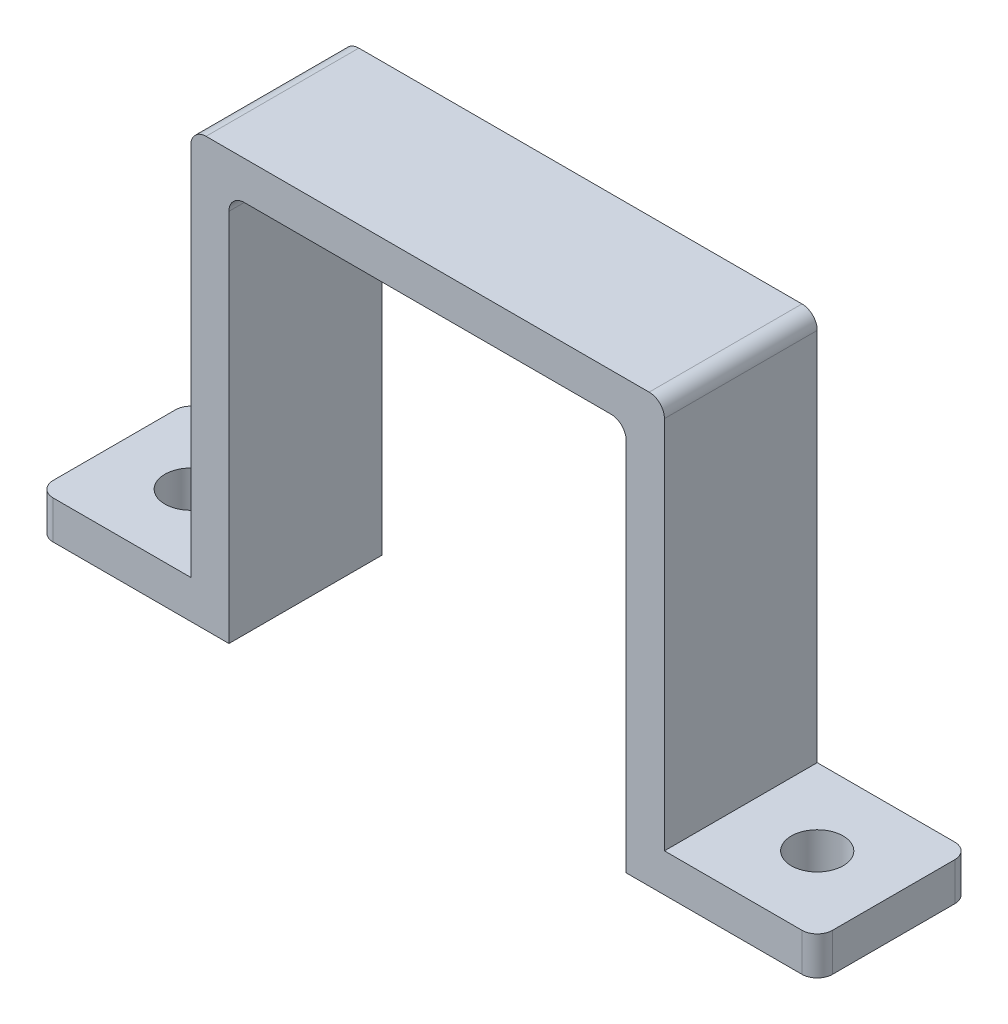
ISO-10303-21;
HEADER;
FILE_DESCRIPTION(('STEP AP214'),'2;1');
FILE_NAME('part.step','',(''),(''),'','','');
FILE_SCHEMA(('AUTOMOTIVE_DESIGN { 1 0 10303 214 1 1 1 1 }'));
ENDSEC;
DATA;
#1=APPLICATION_CONTEXT('core data for automotive mechanical design processes');
#2=APPLICATION_PROTOCOL_DEFINITION('international standard','automotive_design',2000,#1);
#3=PRODUCT_CONTEXT('',#1,'mechanical');
#4=PRODUCT('Part','Part','',(#3));
#5=PRODUCT_RELATED_PRODUCT_CATEGORY('part','',(#4));
#6=PRODUCT_DEFINITION_FORMATION('','',#4);
#7=PRODUCT_DEFINITION_CONTEXT('part definition',#1,'design');
#8=PRODUCT_DEFINITION('design','',#6,#7);
#9=PRODUCT_DEFINITION_SHAPE('','',#8);
#10=(LENGTH_UNIT() NAMED_UNIT(*) SI_UNIT(.MILLI.,.METRE.));
#11=(NAMED_UNIT(*) PLANE_ANGLE_UNIT() SI_UNIT($,.RADIAN.));
#12=(NAMED_UNIT(*) SI_UNIT($,.STERADIAN.) SOLID_ANGLE_UNIT());
#13=UNCERTAINTY_MEASURE_WITH_UNIT(LENGTH_MEASURE(1.E-05),#10,'distance_accuracy_value','');
#14=(GEOMETRIC_REPRESENTATION_CONTEXT(3) GLOBAL_UNCERTAINTY_ASSIGNED_CONTEXT((#13)) GLOBAL_UNIT_ASSIGNED_CONTEXT((#10,
#11,#12)) REPRESENTATION_CONTEXT('',''));
#15=CARTESIAN_POINT('',(0.,0.,0.));
#16=DIRECTION('',(0.,0.,1.));
#17=DIRECTION('',(1.,0.,0.));
#18=AXIS2_PLACEMENT_3D('',#15,#16,#17);
#19=CARTESIAN_POINT('',(-15.875,3.175,12.7));
#20=DIRECTION('',(1.,0.,0.));
#21=DIRECTION('',(0.,0.,-1.));
#22=AXIS2_PLACEMENT_3D('',#19,#20,#21);
#23=PLANE('',#22);
#24=DIRECTION('',(0.,0.,-1.));
#25=VECTOR('',#24,1.);
#26=CARTESIAN_POINT('',(-15.875,3.175,12.7));
#27=LINE('',#26,#25);
#28=CARTESIAN_POINT('',(-15.875,3.175,11.43));
#29=VERTEX_POINT('',#28);
#30=CARTESIAN_POINT('',(-15.875,3.175,1.27));
#31=VERTEX_POINT('',#30);
#32=EDGE_CURVE('E244',#29,#31,#27,.T.);
#33=ORIENTED_EDGE('',*,*,#32,.T.);
#34=DIRECTION('',(0.,-1.,0.));
#35=VECTOR('',#34,1.);
#36=CARTESIAN_POINT('',(-15.875,3.175,1.27));
#37=LINE('',#36,#35);
#38=CARTESIAN_POINT('',(-15.875,0.,1.27));
#39=VERTEX_POINT('',#38);
#40=EDGE_CURVE('E304',#31,#39,#37,.T.);
#41=ORIENTED_EDGE('',*,*,#40,.T.);
#42=DIRECTION('',(0.,0.,-1.));
#43=VECTOR('',#42,1.);
#44=CARTESIAN_POINT('',(-15.875,0.,12.7));
#45=LINE('',#44,#43);
#46=CARTESIAN_POINT('',(-15.875,0.,11.43));
#47=VERTEX_POINT('',#46);
#48=EDGE_CURVE('E206',#47,#39,#45,.T.);
#49=ORIENTED_EDGE('',*,*,#48,.F.);
#50=DIRECTION('',(0.,-1.,0.));
#51=VECTOR('',#50,1.);
#52=CARTESIAN_POINT('',(-15.875,3.175,11.43));
#53=LINE('',#52,#51);
#54=EDGE_CURVE('E301',#47,#29,#53,.F.);
#55=ORIENTED_EDGE('',*,*,#54,.T.);
#56=EDGE_LOOP('',(#33,#41,#49,#55));
#57=FACE_BOUND('',#56,.T.);
#58=ADVANCED_FACE('F43',(#57),#23,.F.);
#59=CARTESIAN_POINT('',(-15.875,0.,12.7));
#60=DIRECTION('',(0.,1.,0.));
#61=DIRECTION('',(0.,0.,1.));
#62=AXIS2_PLACEMENT_3D('',#59,#60,#61);
#63=PLANE('',#62);
#64=CARTESIAN_POINT('',(-9.525,0.,6.35));
#65=DIRECTION('',(0.,1.,0.));
#66=DIRECTION('',(0.,0.,1.));
#67=AXIS2_PLACEMENT_3D('',#64,#65,#66);
#68=CIRCLE('',#67,2.15265);
#69=CARTESIAN_POINT('',(-9.525,0.,8.50265));
#70=VERTEX_POINT('',#69);
#71=EDGE_CURVE('E525',#70,#70,#68,.T.);
#72=ORIENTED_EDGE('',*,*,#71,.T.);
#73=EDGE_LOOP('',(#72));
#74=FACE_BOUND('',#73,.T.);
#75=ORIENTED_EDGE('',*,*,#48,.T.);
#76=CARTESIAN_POINT('',(-14.605,0.,1.27));
#77=DIRECTION('',(0.,1.,0.));
#78=DIRECTION('',(0.,0.,1.));
#79=AXIS2_PLACEMENT_3D('',#76,#77,#78);
#80=CIRCLE('',#79,1.27);
#81=CARTESIAN_POINT('',(-14.605,0.,0.));
#82=VERTEX_POINT('',#81);
#83=EDGE_CURVE('E311',#39,#82,#80,.F.);
#84=ORIENTED_EDGE('',*,*,#83,.T.);
#85=DIRECTION('',(1.,0.,0.));
#86=VECTOR('',#85,1.);
#87=CARTESIAN_POINT('',(-15.875,0.,0.));
#88=LINE('',#87,#86);
#89=CARTESIAN_POINT('',(0.,0.,0.));
#90=VERTEX_POINT('',#89);
#91=EDGE_CURVE('E201',#82,#90,#88,.T.);
#92=ORIENTED_EDGE('',*,*,#91,.T.);
#93=DIRECTION('',(0.,0.,-1.));
#94=VECTOR('',#93,1.);
#95=CARTESIAN_POINT('',(0.,0.,12.7));
#96=LINE('',#95,#94);
#97=CARTESIAN_POINT('',(0.,0.,12.7));
#98=VERTEX_POINT('',#97);
#99=EDGE_CURVE('E197',#98,#90,#96,.T.);
#100=ORIENTED_EDGE('',*,*,#99,.F.);
#101=DIRECTION('',(1.,0.,0.));
#102=VECTOR('',#101,1.);
#103=CARTESIAN_POINT('',(-15.875,0.,12.7));
#104=LINE('',#103,#102);
#105=CARTESIAN_POINT('',(-14.605,0.,12.7));
#106=VERTEX_POINT('',#105);
#107=EDGE_CURVE('E183',#106,#98,#104,.T.);
#108=ORIENTED_EDGE('',*,*,#107,.F.);
#109=CARTESIAN_POINT('',(-14.605,0.,11.43));
#110=DIRECTION('',(0.,1.,0.));
#111=DIRECTION('',(0.,0.,1.));
#112=AXIS2_PLACEMENT_3D('',#109,#110,#111);
#113=CIRCLE('',#112,1.27);
#114=EDGE_CURVE('E308',#106,#47,#113,.F.);
#115=ORIENTED_EDGE('',*,*,#114,.T.);
#116=EDGE_LOOP('',(#75,#84,#92,#100,#108,#115));
#117=FACE_BOUND('',#116,.T.);
#118=ADVANCED_FACE('F199',(#74,#117),#63,.F.);
#119=CARTESIAN_POINT('',(0.,0.,12.7));
#120=DIRECTION('',(-1.,0.,0.));
#121=DIRECTION('',(0.,0.,1.));
#122=AXIS2_PLACEMENT_3D('',#119,#120,#121);
#123=PLANE('',#122);
#124=DIRECTION('',(0.,1.,0.));
#125=VECTOR('',#124,1.);
#126=CARTESIAN_POINT('',(0.,0.,0.));
#127=LINE('',#126,#125);
#128=CARTESIAN_POINT('',(0.,31.115,0.));
#129=VERTEX_POINT('',#128);
#130=EDGE_CURVE('E247',#90,#129,#127,.T.);
#131=ORIENTED_EDGE('',*,*,#130,.T.);
#132=DIRECTION('',(0.,0.,-1.));
#133=VECTOR('',#132,1.);
#134=CARTESIAN_POINT('',(0.,31.115,12.7));
#135=LINE('',#134,#133);
#136=CARTESIAN_POINT('',(0.,31.115,12.7));
#137=VERTEX_POINT('',#136);
#138=EDGE_CURVE('E211',#129,#137,#135,.F.);
#139=ORIENTED_EDGE('',*,*,#138,.T.);
#140=DIRECTION('',(0.,1.,0.));
#141=VECTOR('',#140,1.);
#142=CARTESIAN_POINT('',(0.,0.,12.7));
#143=LINE('',#142,#141);
#144=EDGE_CURVE('E188',#98,#137,#143,.T.);
#145=ORIENTED_EDGE('',*,*,#144,.F.);
#146=ORIENTED_EDGE('',*,*,#99,.T.);
#147=EDGE_LOOP('',(#131,#139,#145,#146));
#148=FACE_BOUND('',#147,.T.);
#149=ADVANCED_FACE('F209',(#148),#123,.F.);
#150=CARTESIAN_POINT('',(0.,32.385,12.7));
#151=DIRECTION('',(0.,1.,0.));
#152=DIRECTION('',(0.,0.,1.));
#153=AXIS2_PLACEMENT_3D('',#150,#151,#152);
#154=PLANE('',#153);
#155=DIRECTION('',(1.,0.,0.));
#156=VECTOR('',#155,1.);
#157=CARTESIAN_POINT('',(0.,32.385,0.));
#158=LINE('',#157,#156);
#159=CARTESIAN_POINT('',(1.27,32.385,0.));
#160=VERTEX_POINT('',#159);
#161=CARTESIAN_POINT('',(31.75,32.385,0.));
#162=VERTEX_POINT('',#161);
#163=EDGE_CURVE('E251',#160,#162,#158,.T.);
#164=ORIENTED_EDGE('',*,*,#163,.T.);
#165=DIRECTION('',(0.,0.,-1.));
#166=VECTOR('',#165,1.);
#167=CARTESIAN_POINT('',(31.75,32.385,12.7));
#168=LINE('',#167,#166);
#169=CARTESIAN_POINT('',(31.75,32.385,12.7));
#170=VERTEX_POINT('',#169);
#171=EDGE_CURVE('E379',#162,#170,#168,.F.);
#172=ORIENTED_EDGE('',*,*,#171,.T.);
#173=DIRECTION('',(1.,0.,0.));
#174=VECTOR('',#173,1.);
#175=CARTESIAN_POINT('',(0.,32.385,12.7));
#176=LINE('',#175,#174);
#177=CARTESIAN_POINT('',(1.27,32.385,12.7));
#178=VERTEX_POINT('',#177);
#179=EDGE_CURVE('E213',#178,#170,#176,.T.);
#180=ORIENTED_EDGE('',*,*,#179,.F.);
#181=DIRECTION('',(0.,0.,-1.));
#182=VECTOR('',#181,1.);
#183=CARTESIAN_POINT('',(1.27,32.385,0.));
#184=LINE('',#183,#182);
#185=EDGE_CURVE('E375',#178,#160,#184,.T.);
#186=ORIENTED_EDGE('',*,*,#185,.T.);
#187=EDGE_LOOP('',(#164,#172,#180,#186));
#188=FACE_BOUND('',#187,.T.);
#189=ADVANCED_FACE('F403',(#188),#154,.F.);
#190=CARTESIAN_POINT('',(33.02,32.385,12.7));
#191=DIRECTION('',(1.,0.,0.));
#192=DIRECTION('',(0.,0.,-1.));
#193=AXIS2_PLACEMENT_3D('',#190,#191,#192);
#194=PLANE('',#193);
#195=DIRECTION('',(0.,-1.,0.));
#196=VECTOR('',#195,1.);
#197=CARTESIAN_POINT('',(33.02,32.385,12.7));
#198=LINE('',#197,#196);
#199=CARTESIAN_POINT('',(33.02,31.115,12.7));
#200=VERTEX_POINT('',#199);
#201=CARTESIAN_POINT('',(33.02,0.,12.7));
#202=VERTEX_POINT('',#201);
#203=EDGE_CURVE('E217',#200,#202,#198,.T.);
#204=ORIENTED_EDGE('',*,*,#203,.F.);
#205=DIRECTION('',(0.,0.,-1.));
#206=VECTOR('',#205,1.);
#207=CARTESIAN_POINT('',(33.02,31.115,0.));
#208=LINE('',#207,#206);
#209=CARTESIAN_POINT('',(33.02,31.115,0.));
#210=VERTEX_POINT('',#209);
#211=EDGE_CURVE('E371',#200,#210,#208,.T.);
#212=ORIENTED_EDGE('',*,*,#211,.T.);
#213=DIRECTION('',(0.,-1.,0.));
#214=VECTOR('',#213,1.);
#215=CARTESIAN_POINT('',(33.02,32.385,0.));
#216=LINE('',#215,#214);
#217=CARTESIAN_POINT('',(33.02,0.,0.));
#218=VERTEX_POINT('',#217);
#219=EDGE_CURVE('E255',#210,#218,#216,.T.);
#220=ORIENTED_EDGE('',*,*,#219,.T.);
#221=DIRECTION('',(0.,0.,-1.));
#222=VECTOR('',#221,1.);
#223=CARTESIAN_POINT('',(33.02,0.,12.7));
#224=LINE('',#223,#222);
#225=EDGE_CURVE('E207',#202,#218,#224,.T.);
#226=ORIENTED_EDGE('',*,*,#225,.F.);
#227=EDGE_LOOP('',(#204,#212,#220,#226));
#228=FACE_BOUND('',#227,.T.);
#229=ADVANCED_FACE('F411',(#228),#194,.F.);
#230=CARTESIAN_POINT('',(33.02,0.,12.7));
#231=DIRECTION('',(0.,1.,0.));
#232=DIRECTION('',(0.,0.,1.));
#233=AXIS2_PLACEMENT_3D('',#230,#231,#232);
#234=PLANE('',#233);
#235=CARTESIAN_POINT('',(42.545,0.,6.35));
#236=DIRECTION('',(0.,1.,0.));
#237=DIRECTION('',(0.,0.,1.));
#238=AXIS2_PLACEMENT_3D('',#235,#236,#237);
#239=CIRCLE('',#238,2.15265);
#240=CARTESIAN_POINT('',(42.545,0.,8.50265));
#241=VERTEX_POINT('',#240);
#242=EDGE_CURVE('E248',#241,#241,#239,.T.);
#243=ORIENTED_EDGE('',*,*,#242,.T.);
#244=EDGE_LOOP('',(#243));
#245=FACE_BOUND('',#244,.T.);
#246=DIRECTION('',(1.,0.,0.));
#247=VECTOR('',#246,1.);
#248=CARTESIAN_POINT('',(33.02,0.,0.));
#249=LINE('',#248,#247);
#250=CARTESIAN_POINT('',(47.625,0.,0.));
#251=VERTEX_POINT('',#250);
#252=EDGE_CURVE('E258',#218,#251,#249,.T.);
#253=ORIENTED_EDGE('',*,*,#252,.T.);
#254=CARTESIAN_POINT('',(47.625,0.,1.27));
#255=DIRECTION('',(0.,1.,0.));
#256=DIRECTION('',(0.,0.,1.));
#257=AXIS2_PLACEMENT_3D('',#254,#255,#256);
#258=CIRCLE('',#257,1.27);
#259=CARTESIAN_POINT('',(48.895,0.,1.27));
#260=VERTEX_POINT('',#259);
#261=EDGE_CURVE('E59',#251,#260,#258,.F.);
#262=ORIENTED_EDGE('',*,*,#261,.T.);
#263=DIRECTION('',(0.,0.,-1.));
#264=VECTOR('',#263,1.);
#265=CARTESIAN_POINT('',(48.895,0.,12.7));
#266=LINE('',#265,#264);
#267=CARTESIAN_POINT('',(48.895,0.,11.43));
#268=VERTEX_POINT('',#267);
#269=EDGE_CURVE('E293',#268,#260,#266,.T.);
#270=ORIENTED_EDGE('',*,*,#269,.F.);
#271=CARTESIAN_POINT('',(47.625,0.,11.43));
#272=DIRECTION('',(0.,1.,0.));
#273=DIRECTION('',(0.,0.,1.));
#274=AXIS2_PLACEMENT_3D('',#271,#272,#273);
#275=CIRCLE('',#274,1.27);
#276=CARTESIAN_POINT('',(47.625,0.,12.7));
#277=VERTEX_POINT('',#276);
#278=EDGE_CURVE('E356',#268,#277,#275,.F.);
#279=ORIENTED_EDGE('',*,*,#278,.T.);
#280=DIRECTION('',(1.,0.,0.));
#281=VECTOR('',#280,1.);
#282=CARTESIAN_POINT('',(33.02,0.,12.7));
#283=LINE('',#282,#281);
#284=EDGE_CURVE('E223',#202,#277,#283,.T.);
#285=ORIENTED_EDGE('',*,*,#284,.F.);
#286=ORIENTED_EDGE('',*,*,#225,.T.);
#287=EDGE_LOOP('',(#253,#262,#270,#279,#285,#286));
#288=FACE_BOUND('',#287,.T.);
#289=ADVANCED_FACE('F415',(#245,#288),#234,.F.);
#290=CARTESIAN_POINT('',(48.895,0.,12.7));
#291=DIRECTION('',(-1.,0.,0.));
#292=DIRECTION('',(0.,0.,1.));
#293=AXIS2_PLACEMENT_3D('',#290,#291,#292);
#294=PLANE('',#293);
#295=ORIENTED_EDGE('',*,*,#269,.T.);
#296=DIRECTION('',(0.,1.,0.));
#297=VECTOR('',#296,1.);
#298=CARTESIAN_POINT('',(48.895,0.,1.27));
#299=LINE('',#298,#297);
#300=CARTESIAN_POINT('',(48.895,3.17500000000001,1.27));
#301=VERTEX_POINT('',#300);
#302=EDGE_CURVE('E346',#260,#301,#299,.T.);
#303=ORIENTED_EDGE('',*,*,#302,.T.);
#304=DIRECTION('',(0.,0.,-1.));
#305=VECTOR('',#304,1.);
#306=CARTESIAN_POINT('',(48.895,3.17500000000001,12.7));
#307=LINE('',#306,#305);
#308=CARTESIAN_POINT('',(48.895,3.17500000000001,11.43));
#309=VERTEX_POINT('',#308);
#310=EDGE_CURVE('E289',#309,#301,#307,.T.);
#311=ORIENTED_EDGE('',*,*,#310,.F.);
#312=DIRECTION('',(0.,1.,0.));
#313=VECTOR('',#312,1.);
#314=CARTESIAN_POINT('',(48.895,0.,11.43));
#315=LINE('',#314,#313);
#316=EDGE_CURVE('E66',#309,#268,#315,.F.);
#317=ORIENTED_EDGE('',*,*,#316,.T.);
#318=EDGE_LOOP('',(#295,#303,#311,#317));
#319=FACE_BOUND('',#318,.T.);
#320=ADVANCED_FACE('F424',(#319),#294,.F.);
#321=CARTESIAN_POINT('',(48.895,3.17500000000001,12.7));
#322=DIRECTION('',(0.,-1.,0.));
#323=DIRECTION('',(1.,0.,0.));
#324=AXIS2_PLACEMENT_3D('',#321,#322,#323);
#325=PLANE('',#324);
#326=CARTESIAN_POINT('',(42.545,3.17500000000001,6.35));
#327=DIRECTION('',(0.,1.,0.));
#328=DIRECTION('',(0.,0.,1.));
#329=AXIS2_PLACEMENT_3D('',#326,#327,#328);
#330=CIRCLE('',#329,2.15264999999999);
#331=CARTESIAN_POINT('',(42.545,3.17500000000001,8.50264999999998));
#332=VERTEX_POINT('',#331);
#333=EDGE_CURVE('E523',#332,#332,#330,.T.);
#334=ORIENTED_EDGE('',*,*,#333,.F.);
#335=EDGE_LOOP('',(#334));
#336=FACE_BOUND('',#335,.T.);
#337=ORIENTED_EDGE('',*,*,#310,.T.);
#338=CARTESIAN_POINT('',(47.625,3.17500000000001,1.27));
#339=DIRECTION('',(0.,-1.,0.));
#340=DIRECTION('',(1.,0.,0.));
#341=AXIS2_PLACEMENT_3D('',#338,#339,#340);
#342=CIRCLE('',#341,1.27);
#343=CARTESIAN_POINT('',(47.625,3.17500000000001,0.));
#344=VERTEX_POINT('',#343);
#345=EDGE_CURVE('E353',#301,#344,#342,.F.);
#346=ORIENTED_EDGE('',*,*,#345,.T.);
#347=DIRECTION('',(-1.,0.,0.));
#348=VECTOR('',#347,1.);
#349=CARTESIAN_POINT('',(48.895,3.17500000000001,0.));
#350=LINE('',#349,#348);
#351=CARTESIAN_POINT('',(36.195,3.17500000000001,0.));
#352=VERTEX_POINT('',#351);
#353=EDGE_CURVE('E261',#344,#352,#350,.T.);
#354=ORIENTED_EDGE('',*,*,#353,.T.);
#355=DIRECTION('',(0.,0.,-1.));
#356=VECTOR('',#355,1.);
#357=CARTESIAN_POINT('',(36.195,3.17500000000001,12.7));
#358=LINE('',#357,#356);
#359=CARTESIAN_POINT('',(36.195,3.17500000000001,12.7));
#360=VERTEX_POINT('',#359);
#361=EDGE_CURVE('E285',#360,#352,#358,.T.);
#362=ORIENTED_EDGE('',*,*,#361,.F.);
#363=DIRECTION('',(-1.,0.,0.));
#364=VECTOR('',#363,1.);
#365=CARTESIAN_POINT('',(48.895,3.17500000000001,12.7));
#366=LINE('',#365,#364);
#367=CARTESIAN_POINT('',(47.625,3.17500000000001,12.7));
#368=VERTEX_POINT('',#367);
#369=EDGE_CURVE('E227',#368,#360,#366,.T.);
#370=ORIENTED_EDGE('',*,*,#369,.F.);
#371=CARTESIAN_POINT('',(47.625,3.17500000000001,11.43));
#372=DIRECTION('',(0.,-1.,0.));
#373=DIRECTION('',(1.,0.,0.));
#374=AXIS2_PLACEMENT_3D('',#371,#372,#373);
#375=CIRCLE('',#374,1.27);
#376=EDGE_CURVE('E350',#368,#309,#375,.F.);
#377=ORIENTED_EDGE('',*,*,#376,.T.);
#378=EDGE_LOOP('',(#337,#346,#354,#362,#370,#377));
#379=FACE_BOUND('',#378,.T.);
#380=ADVANCED_FACE('F422',(#336,#379),#325,.F.);
#381=CARTESIAN_POINT('',(36.195,3.17500000000001,12.7));
#382=DIRECTION('',(-1.,0.,0.));
#383=DIRECTION('',(0.,0.,1.));
#384=AXIS2_PLACEMENT_3D('',#381,#382,#383);
#385=PLANE('',#384);
#386=DIRECTION('',(0.,1.,0.));
#387=VECTOR('',#386,1.);
#388=CARTESIAN_POINT('',(36.195,3.17500000000001,0.));
#389=LINE('',#388,#387);
#390=CARTESIAN_POINT('',(36.195,34.29,0.));
#391=VERTEX_POINT('',#390);
#392=EDGE_CURVE('E264',#352,#391,#389,.T.);
#393=ORIENTED_EDGE('',*,*,#392,.T.);
#394=DIRECTION('',(0.,0.,-1.));
#395=VECTOR('',#394,1.);
#396=CARTESIAN_POINT('',(36.195,34.29,12.7));
#397=LINE('',#396,#395);
#398=CARTESIAN_POINT('',(36.195,34.29,12.7));
#399=VERTEX_POINT('',#398);
#400=EDGE_CURVE('E368',#391,#399,#397,.F.);
#401=ORIENTED_EDGE('',*,*,#400,.T.);
#402=DIRECTION('',(0.,1.,0.));
#403=VECTOR('',#402,1.);
#404=CARTESIAN_POINT('',(36.195,3.17500000000001,12.7));
#405=LINE('',#404,#403);
#406=EDGE_CURVE('E230',#360,#399,#405,.T.);
#407=ORIENTED_EDGE('',*,*,#406,.F.);
#408=ORIENTED_EDGE('',*,*,#361,.T.);
#409=EDGE_LOOP('',(#393,#401,#407,#408));
#410=FACE_BOUND('',#409,.T.);
#411=ADVANCED_FACE('F434',(#410),#385,.F.);
#412=CARTESIAN_POINT('',(36.195,35.56,12.7));
#413=DIRECTION('',(0.,-1.,0.));
#414=DIRECTION('',(1.,0.,0.));
#415=AXIS2_PLACEMENT_3D('',#412,#413,#414);
#416=PLANE('',#415);
#417=DIRECTION('',(-1.,0.,0.));
#418=VECTOR('',#417,1.);
#419=CARTESIAN_POINT('',(36.195,35.56,12.7));
#420=LINE('',#419,#418);
#421=CARTESIAN_POINT('',(34.925,35.56,12.7));
#422=VERTEX_POINT('',#421);
#423=CARTESIAN_POINT('',(-1.905,35.56,12.7));
#424=VERTEX_POINT('',#423);
#425=EDGE_CURVE('E234',#422,#424,#420,.T.);
#426=ORIENTED_EDGE('',*,*,#425,.F.);
#427=DIRECTION('',(0.,0.,-1.));
#428=VECTOR('',#427,1.);
#429=CARTESIAN_POINT('',(34.925,35.56,12.7));
#430=LINE('',#429,#428);
#431=CARTESIAN_POINT('',(34.925,35.56,0.));
#432=VERTEX_POINT('',#431);
#433=EDGE_CURVE('E364',#422,#432,#430,.T.);
#434=ORIENTED_EDGE('',*,*,#433,.T.);
#435=DIRECTION('',(-1.,0.,0.));
#436=VECTOR('',#435,1.);
#437=CARTESIAN_POINT('',(36.195,35.56,0.));
#438=LINE('',#437,#436);
#439=CARTESIAN_POINT('',(-1.905,35.56,0.));
#440=VERTEX_POINT('',#439);
#441=EDGE_CURVE('E268',#432,#440,#438,.T.);
#442=ORIENTED_EDGE('',*,*,#441,.T.);
#443=DIRECTION('',(0.,0.,-1.));
#444=VECTOR('',#443,1.);
#445=CARTESIAN_POINT('',(-1.905,35.56,12.7));
#446=LINE('',#445,#444);
#447=EDGE_CURVE('E361',#440,#424,#446,.F.);
#448=ORIENTED_EDGE('',*,*,#447,.T.);
#449=EDGE_LOOP('',(#426,#434,#442,#448));
#450=FACE_BOUND('',#449,.T.);
#451=ADVANCED_FACE('F443',(#450),#416,.F.);
#452=CARTESIAN_POINT('',(-3.175,35.56,12.7));
#453=DIRECTION('',(1.,0.,0.));
#454=DIRECTION('',(0.,1.,0.));
#455=AXIS2_PLACEMENT_3D('',#452,#453,#454);
#456=PLANE('',#455);
#457=DIRECTION('',(0.,-1.,0.));
#458=VECTOR('',#457,1.);
#459=CARTESIAN_POINT('',(-3.175,35.56,12.7));
#460=LINE('',#459,#458);
#461=CARTESIAN_POINT('',(-3.175,34.29,12.7));
#462=VERTEX_POINT('',#461);
#463=CARTESIAN_POINT('',(-3.175,3.175,12.7));
#464=VERTEX_POINT('',#463);
#465=EDGE_CURVE('E238',#462,#464,#460,.T.);
#466=ORIENTED_EDGE('',*,*,#465,.F.);
#467=DIRECTION('',(0.,0.,-1.));
#468=VECTOR('',#467,1.);
#469=CARTESIAN_POINT('',(-3.175,34.29,12.7));
#470=LINE('',#469,#468);
#471=CARTESIAN_POINT('',(-3.175,34.29,0.));
#472=VERTEX_POINT('',#471);
#473=EDGE_CURVE('E384',#462,#472,#470,.T.);
#474=ORIENTED_EDGE('',*,*,#473,.T.);
#475=DIRECTION('',(0.,-1.,0.));
#476=VECTOR('',#475,1.);
#477=CARTESIAN_POINT('',(-3.175,35.56,0.));
#478=LINE('',#477,#476);
#479=CARTESIAN_POINT('',(-3.175,3.175,0.));
#480=VERTEX_POINT('',#479);
#481=EDGE_CURVE('E272',#472,#480,#478,.T.);
#482=ORIENTED_EDGE('',*,*,#481,.T.);
#483=DIRECTION('',(0.,0.,-1.));
#484=VECTOR('',#483,1.);
#485=CARTESIAN_POINT('',(-3.175,3.175,12.7));
#486=LINE('',#485,#484);
#487=EDGE_CURVE('E281',#464,#480,#486,.T.);
#488=ORIENTED_EDGE('',*,*,#487,.F.);
#489=EDGE_LOOP('',(#466,#474,#482,#488));
#490=FACE_BOUND('',#489,.T.);
#491=ADVANCED_FACE('F450',(#490),#456,.F.);
#492=CARTESIAN_POINT('',(-3.175,3.175,12.7));
#493=DIRECTION('',(0.,-1.,0.));
#494=DIRECTION('',(1.,0.,0.));
#495=AXIS2_PLACEMENT_3D('',#492,#493,#494);
#496=PLANE('',#495);
#497=CARTESIAN_POINT('',(-9.525,3.175,6.35));
#498=DIRECTION('',(0.,1.,0.));
#499=DIRECTION('',(0.,0.,1.));
#500=AXIS2_PLACEMENT_3D('',#497,#498,#499);
#501=CIRCLE('',#500,2.15264999999999);
#502=CARTESIAN_POINT('',(-9.525,3.175,8.50264999999999));
#503=VERTEX_POINT('',#502);
#504=EDGE_CURVE('E530',#503,#503,#501,.T.);
#505=ORIENTED_EDGE('',*,*,#504,.F.);
#506=EDGE_LOOP('',(#505));
#507=FACE_BOUND('',#506,.T.);
#508=DIRECTION('',(-1.,0.,0.));
#509=VECTOR('',#508,1.);
#510=CARTESIAN_POINT('',(-3.175,3.175,0.));
#511=LINE('',#510,#509);
#512=CARTESIAN_POINT('',(-14.605,3.175,0.));
#513=VERTEX_POINT('',#512);
#514=EDGE_CURVE('E194',#480,#513,#511,.T.);
#515=ORIENTED_EDGE('',*,*,#514,.T.);
#516=CARTESIAN_POINT('',(-14.605,3.175,1.27));
#517=DIRECTION('',(0.,-1.,0.));
#518=DIRECTION('',(1.,0.,0.));
#519=AXIS2_PLACEMENT_3D('',#516,#517,#518);
#520=CIRCLE('',#519,1.27);
#521=EDGE_CURVE('E329',#513,#31,#520,.F.);
#522=ORIENTED_EDGE('',*,*,#521,.T.);
#523=ORIENTED_EDGE('',*,*,#32,.F.);
#524=CARTESIAN_POINT('',(-14.605,3.175,11.43));
#525=DIRECTION('',(0.,-1.,0.));
#526=DIRECTION('',(1.,0.,0.));
#527=AXIS2_PLACEMENT_3D('',#524,#525,#526);
#528=CIRCLE('',#527,1.27);
#529=CARTESIAN_POINT('',(-14.605,3.175,12.7));
#530=VERTEX_POINT('',#529);
#531=EDGE_CURVE('E326',#29,#530,#528,.F.);
#532=ORIENTED_EDGE('',*,*,#531,.T.);
#533=DIRECTION('',(-1.,0.,0.));
#534=VECTOR('',#533,1.);
#535=CARTESIAN_POINT('',(-3.175,3.175,12.7));
#536=LINE('',#535,#534);
#537=EDGE_CURVE('E241',#464,#530,#536,.T.);
#538=ORIENTED_EDGE('',*,*,#537,.F.);
#539=ORIENTED_EDGE('',*,*,#487,.T.);
#540=EDGE_LOOP('',(#515,#522,#523,#532,#538,#539));
#541=FACE_BOUND('',#540,.T.);
#542=ADVANCED_FACE('F455',(#507,#541),#496,.F.);
#543=CARTESIAN_POINT('',(0.,0.,12.7));
#544=DIRECTION('',(0.,0.,1.));
#545=DIRECTION('',(1.,0.,0.));
#546=AXIS2_PLACEMENT_3D('',#543,#544,#545);
#547=PLANE('',#546);
#548=ORIENTED_EDGE('',*,*,#537,.T.);
#549=DIRECTION('',(0.,-1.,0.));
#550=VECTOR('',#549,1.);
#551=CARTESIAN_POINT('',(-14.605,0.,12.7));
#552=LINE('',#551,#550);
#553=EDGE_CURVE('E191',#530,#106,#552,.T.);
#554=ORIENTED_EDGE('',*,*,#553,.T.);
#555=ORIENTED_EDGE('',*,*,#107,.T.);
#556=ORIENTED_EDGE('',*,*,#144,.T.);
#557=CARTESIAN_POINT('',(1.27,31.115,12.7));
#558=DIRECTION('',(0.,0.,1.));
#559=DIRECTION('',(1.,0.,0.));
#560=AXIS2_PLACEMENT_3D('',#557,#558,#559);
#561=CIRCLE('',#560,1.27);
#562=EDGE_CURVE('E11',#137,#178,#561,.F.);
#563=ORIENTED_EDGE('',*,*,#562,.T.);
#564=ORIENTED_EDGE('',*,*,#179,.T.);
#565=CARTESIAN_POINT('',(31.75,31.115,12.7));
#566=DIRECTION('',(0.,0.,1.));
#567=DIRECTION('',(1.,0.,0.));
#568=AXIS2_PLACEMENT_3D('',#565,#566,#567);
#569=CIRCLE('',#568,1.27);
#570=EDGE_CURVE('E391',#170,#200,#569,.F.);
#571=ORIENTED_EDGE('',*,*,#570,.T.);
#572=ORIENTED_EDGE('',*,*,#203,.T.);
#573=ORIENTED_EDGE('',*,*,#284,.T.);
#574=DIRECTION('',(0.,1.,0.));
#575=VECTOR('',#574,1.);
#576=CARTESIAN_POINT('',(47.625,3.17500000000001,12.7));
#577=LINE('',#576,#575);
#578=EDGE_CURVE('E338',#277,#368,#577,.T.);
#579=ORIENTED_EDGE('',*,*,#578,.T.);
#580=ORIENTED_EDGE('',*,*,#369,.T.);
#581=ORIENTED_EDGE('',*,*,#406,.T.);
#582=CARTESIAN_POINT('',(34.925,34.29,12.7));
#583=DIRECTION('',(0.,0.,1.));
#584=DIRECTION('',(1.,0.,0.));
#585=AXIS2_PLACEMENT_3D('',#582,#583,#584);
#586=CIRCLE('',#585,1.27);
#587=EDGE_CURVE('E335',#399,#422,#586,.T.);
#588=ORIENTED_EDGE('',*,*,#587,.T.);
#589=ORIENTED_EDGE('',*,*,#425,.T.);
#590=CARTESIAN_POINT('',(-1.905,34.29,12.7));
#591=DIRECTION('',(0.,0.,1.));
#592=DIRECTION('',(1.,0.,0.));
#593=AXIS2_PLACEMENT_3D('',#590,#591,#592);
#594=CIRCLE('',#593,1.27);
#595=EDGE_CURVE('E332',#424,#462,#594,.T.);
#596=ORIENTED_EDGE('',*,*,#595,.T.);
#597=ORIENTED_EDGE('',*,*,#465,.T.);
#598=EDGE_LOOP('',(#548,#554,#555,#556,#563,#564,#571,#572,#573,#579,#580,#581,#588,#589,#596,#597));
#599=FACE_BOUND('',#598,.T.);
#600=ADVANCED_FACE('F186',(#599),#547,.T.);
#601=CARTESIAN_POINT('',(0.,0.,0.));
#602=DIRECTION('',(0.,0.,1.));
#603=DIRECTION('',(1.,0.,0.));
#604=AXIS2_PLACEMENT_3D('',#601,#602,#603);
#605=PLANE('',#604);
#606=ORIENTED_EDGE('',*,*,#91,.F.);
#607=DIRECTION('',(0.,-1.,0.));
#608=VECTOR('',#607,1.);
#609=CARTESIAN_POINT('',(-14.605,0.,0.));
#610=LINE('',#609,#608);
#611=EDGE_CURVE('E323',#82,#513,#610,.F.);
#612=ORIENTED_EDGE('',*,*,#611,.T.);
#613=ORIENTED_EDGE('',*,*,#514,.F.);
#614=ORIENTED_EDGE('',*,*,#481,.F.);
#615=CARTESIAN_POINT('',(-1.905,34.29,0.));
#616=DIRECTION('',(0.,0.,1.));
#617=DIRECTION('',(1.,0.,0.));
#618=AXIS2_PLACEMENT_3D('',#615,#616,#617);
#619=CIRCLE('',#618,1.27);
#620=EDGE_CURVE('E314',#472,#440,#619,.F.);
#621=ORIENTED_EDGE('',*,*,#620,.T.);
#622=ORIENTED_EDGE('',*,*,#441,.F.);
#623=CARTESIAN_POINT('',(34.925,34.29,0.));
#624=DIRECTION('',(0.,0.,1.));
#625=DIRECTION('',(1.,0.,0.));
#626=AXIS2_PLACEMENT_3D('',#623,#624,#625);
#627=CIRCLE('',#626,1.27);
#628=EDGE_CURVE('E317',#432,#391,#627,.F.);
#629=ORIENTED_EDGE('',*,*,#628,.T.);
#630=ORIENTED_EDGE('',*,*,#392,.F.);
#631=ORIENTED_EDGE('',*,*,#353,.F.);
#632=DIRECTION('',(0.,1.,0.));
#633=VECTOR('',#632,1.);
#634=CARTESIAN_POINT('',(47.625,0.,0.));
#635=LINE('',#634,#633);
#636=EDGE_CURVE('E320',#344,#251,#635,.F.);
#637=ORIENTED_EDGE('',*,*,#636,.T.);
#638=ORIENTED_EDGE('',*,*,#252,.F.);
#639=ORIENTED_EDGE('',*,*,#219,.F.);
#640=CARTESIAN_POINT('',(31.75,31.115,0.));
#641=DIRECTION('',(0.,0.,1.));
#642=DIRECTION('',(1.,0.,0.));
#643=AXIS2_PLACEMENT_3D('',#640,#641,#642);
#644=CIRCLE('',#643,1.27);
#645=EDGE_CURVE('E388',#210,#162,#644,.T.);
#646=ORIENTED_EDGE('',*,*,#645,.T.);
#647=ORIENTED_EDGE('',*,*,#163,.F.);
#648=CARTESIAN_POINT('',(1.27,31.115,0.));
#649=DIRECTION('',(0.,0.,1.));
#650=DIRECTION('',(1.,0.,0.));
#651=AXIS2_PLACEMENT_3D('',#648,#649,#650);
#652=CIRCLE('',#651,1.27);
#653=EDGE_CURVE('E52',#160,#129,#652,.T.);
#654=ORIENTED_EDGE('',*,*,#653,.T.);
#655=ORIENTED_EDGE('',*,*,#130,.F.);
#656=EDGE_LOOP('',(#606,#612,#613,#614,#621,#622,#629,#630,#631,#637,#638,#639,#646,#647,#654,#655));
#657=FACE_BOUND('',#656,.T.);
#658=ADVANCED_FACE('F396',(#657),#605,.F.);
#659=CARTESIAN_POINT('',(42.545,3.17500000000001,6.35));
#660=DIRECTION('',(0.,1.,0.));
#661=DIRECTION('',(0.,0.,1.));
#662=AXIS2_PLACEMENT_3D('',#659,#660,#661);
#663=CYLINDRICAL_SURFACE('',#662,2.15264999999999);
#664=ORIENTED_EDGE('',*,*,#242,.F.);
#665=EDGE_LOOP('',(#664));
#666=FACE_BOUND('',#665,.T.);
#667=ORIENTED_EDGE('',*,*,#333,.T.);
#668=EDGE_LOOP('',(#667));
#669=FACE_BOUND('',#668,.T.);
#670=ADVANCED_FACE('F476',(#666,#669),#663,.F.);
#671=CARTESIAN_POINT('',(-9.525,3.175,6.35));
#672=DIRECTION('',(0.,1.,0.));
#673=DIRECTION('',(0.,0.,1.));
#674=AXIS2_PLACEMENT_3D('',#671,#672,#673);
#675=CYLINDRICAL_SURFACE('',#674,2.15264999999999);
#676=ORIENTED_EDGE('',*,*,#71,.F.);
#677=EDGE_LOOP('',(#676));
#678=FACE_BOUND('',#677,.T.);
#679=ORIENTED_EDGE('',*,*,#504,.T.);
#680=EDGE_LOOP('',(#679));
#681=FACE_BOUND('',#680,.T.);
#682=ADVANCED_FACE('F469',(#678,#681),#675,.F.);
#683=CARTESIAN_POINT('',(-14.605,3.175,1.27));
#684=DIRECTION('',(0.,-1.,0.));
#685=DIRECTION('',(0.,0.,-1.));
#686=AXIS2_PLACEMENT_3D('',#683,#684,#685);
#687=CYLINDRICAL_SURFACE('',#686,1.27);
#688=ORIENTED_EDGE('',*,*,#521,.F.);
#689=ORIENTED_EDGE('',*,*,#611,.F.);
#690=ORIENTED_EDGE('',*,*,#83,.F.);
#691=ORIENTED_EDGE('',*,*,#40,.F.);
#692=EDGE_LOOP('',(#688,#689,#690,#691));
#693=FACE_BOUND('',#692,.T.);
#694=ADVANCED_FACE('F466',(#693),#687,.T.);
#695=CARTESIAN_POINT('',(-14.605,0.,11.43));
#696=DIRECTION('',(0.,1.,0.));
#697=DIRECTION('',(0.,0.,1.));
#698=AXIS2_PLACEMENT_3D('',#695,#696,#697);
#699=CYLINDRICAL_SURFACE('',#698,1.27);
#700=ORIENTED_EDGE('',*,*,#531,.F.);
#701=ORIENTED_EDGE('',*,*,#54,.F.);
#702=ORIENTED_EDGE('',*,*,#114,.F.);
#703=ORIENTED_EDGE('',*,*,#553,.F.);
#704=EDGE_LOOP('',(#700,#701,#702,#703));
#705=FACE_BOUND('',#704,.T.);
#706=ADVANCED_FACE('F459',(#705),#699,.T.);
#707=CARTESIAN_POINT('',(47.625,0.,1.27));
#708=DIRECTION('',(0.,1.,0.));
#709=DIRECTION('',(0.,0.,1.));
#710=AXIS2_PLACEMENT_3D('',#707,#708,#709);
#711=CYLINDRICAL_SURFACE('',#710,1.27);
#712=ORIENTED_EDGE('',*,*,#261,.F.);
#713=ORIENTED_EDGE('',*,*,#636,.F.);
#714=ORIENTED_EDGE('',*,*,#345,.F.);
#715=ORIENTED_EDGE('',*,*,#302,.F.);
#716=EDGE_LOOP('',(#712,#713,#714,#715));
#717=FACE_BOUND('',#716,.T.);
#718=ADVANCED_FACE('F427',(#717),#711,.T.);
#719=CARTESIAN_POINT('',(47.625,0.,11.43));
#720=DIRECTION('',(0.,-1.,0.));
#721=DIRECTION('',(0.,0.,-1.));
#722=AXIS2_PLACEMENT_3D('',#719,#720,#721);
#723=CYLINDRICAL_SURFACE('',#722,1.27);
#724=ORIENTED_EDGE('',*,*,#278,.F.);
#725=ORIENTED_EDGE('',*,*,#316,.F.);
#726=ORIENTED_EDGE('',*,*,#376,.F.);
#727=ORIENTED_EDGE('',*,*,#578,.F.);
#728=EDGE_LOOP('',(#724,#725,#726,#727));
#729=FACE_BOUND('',#728,.T.);
#730=ADVANCED_FACE('F420',(#729),#723,.T.);
#731=CARTESIAN_POINT('',(34.925,34.29,12.7));
#732=DIRECTION('',(0.,0.,-1.));
#733=DIRECTION('',(-1.,0.,0.));
#734=AXIS2_PLACEMENT_3D('',#731,#732,#733);
#735=CYLINDRICAL_SURFACE('',#734,1.27);
#736=ORIENTED_EDGE('',*,*,#587,.F.);
#737=ORIENTED_EDGE('',*,*,#400,.F.);
#738=ORIENTED_EDGE('',*,*,#628,.F.);
#739=ORIENTED_EDGE('',*,*,#433,.F.);
#740=EDGE_LOOP('',(#736,#737,#738,#739));
#741=FACE_BOUND('',#740,.T.);
#742=ADVANCED_FACE('F438',(#741),#735,.T.);
#743=CARTESIAN_POINT('',(31.75,31.115,12.7));
#744=DIRECTION('',(0.,0.,1.));
#745=DIRECTION('',(1.,0.,0.));
#746=AXIS2_PLACEMENT_3D('',#743,#744,#745);
#747=CYLINDRICAL_SURFACE('',#746,1.27);
#748=ORIENTED_EDGE('',*,*,#570,.F.);
#749=ORIENTED_EDGE('',*,*,#171,.F.);
#750=ORIENTED_EDGE('',*,*,#645,.F.);
#751=ORIENTED_EDGE('',*,*,#211,.F.);
#752=EDGE_LOOP('',(#748,#749,#750,#751));
#753=FACE_BOUND('',#752,.T.);
#754=ADVANCED_FACE('F406',(#753),#747,.F.);
#755=CARTESIAN_POINT('',(1.27,31.115,12.7));
#756=DIRECTION('',(0.,0.,1.));
#757=DIRECTION('',(1.,0.,0.));
#758=AXIS2_PLACEMENT_3D('',#755,#756,#757);
#759=CYLINDRICAL_SURFACE('',#758,1.27);
#760=ORIENTED_EDGE('',*,*,#562,.F.);
#761=ORIENTED_EDGE('',*,*,#138,.F.);
#762=ORIENTED_EDGE('',*,*,#653,.F.);
#763=ORIENTED_EDGE('',*,*,#185,.F.);
#764=EDGE_LOOP('',(#760,#761,#762,#763));
#765=FACE_BOUND('',#764,.T.);
#766=ADVANCED_FACE('F399',(#765),#759,.F.);
#767=CARTESIAN_POINT('',(-1.905,34.29,12.7));
#768=DIRECTION('',(0.,0.,-1.));
#769=DIRECTION('',(-1.,0.,0.));
#770=AXIS2_PLACEMENT_3D('',#767,#768,#769);
#771=CYLINDRICAL_SURFACE('',#770,1.27);
#772=ORIENTED_EDGE('',*,*,#595,.F.);
#773=ORIENTED_EDGE('',*,*,#447,.F.);
#774=ORIENTED_EDGE('',*,*,#620,.F.);
#775=ORIENTED_EDGE('',*,*,#473,.F.);
#776=EDGE_LOOP('',(#772,#773,#774,#775));
#777=FACE_BOUND('',#776,.T.);
#778=ADVANCED_FACE('F45',(#777),#771,.T.);
#779=CLOSED_SHELL('',(#58,#118,#149,#189,#229,#289,#320,#380,#411,#451,#491,#542,#600,#658,#670,
#682,#694,#706,#718,#730,#742,#754,#766,#778));
#780=MANIFOLD_SOLID_BREP('B2',#779);
#781=ADVANCED_BREP_SHAPE_REPRESENTATION('',(#18,#780),#14);
#782=SHAPE_DEFINITION_REPRESENTATION(#9,#781);
ENDSEC;
END-ISO-10303-21;
